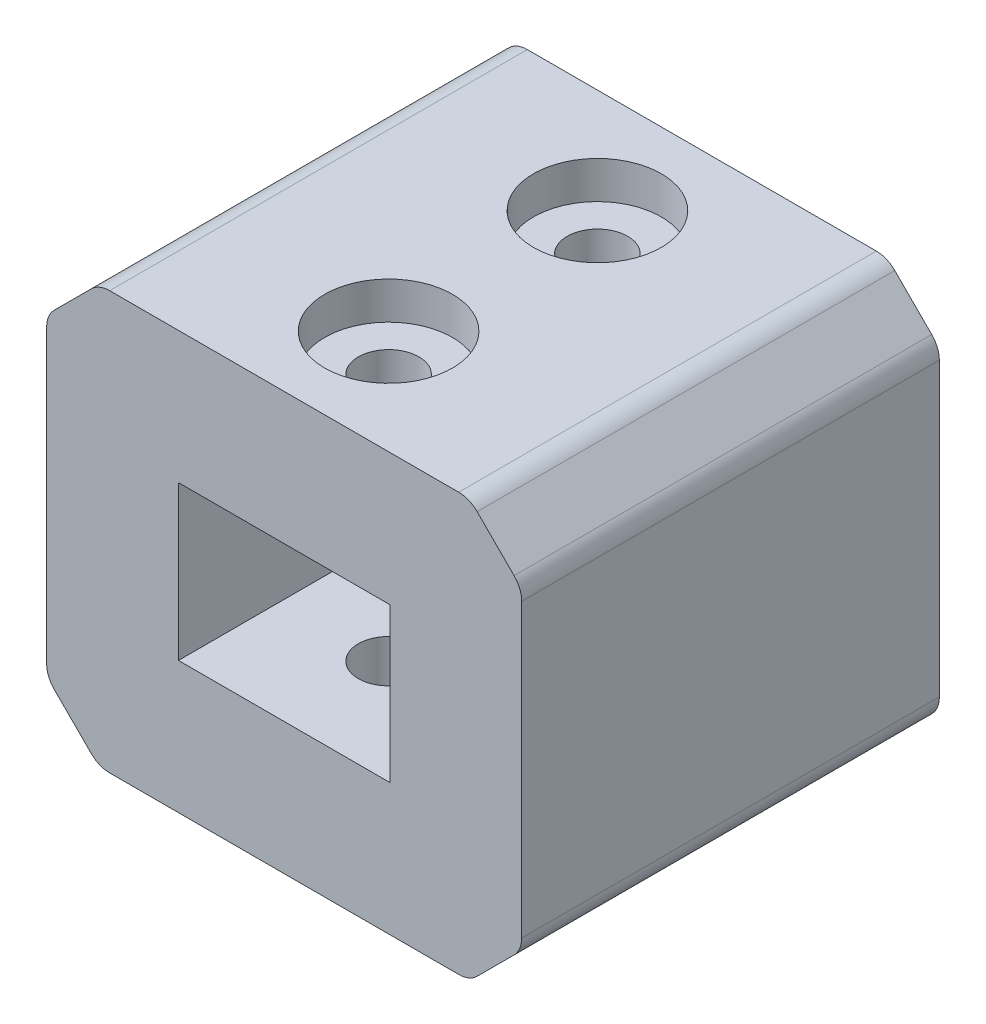
ISO-10303-21;
HEADER;
FILE_DESCRIPTION(('STEP AP214'),'2;1');
FILE_NAME('part.step','',(''),(''),'','','');
FILE_SCHEMA(('AUTOMOTIVE_DESIGN { 1 0 10303 214 1 1 1 1 }'));
ENDSEC;
DATA;
#1=APPLICATION_CONTEXT('core data for automotive mechanical design processes');
#2=APPLICATION_PROTOCOL_DEFINITION('international standard','automotive_design',2000,#1);
#3=PRODUCT_CONTEXT('',#1,'mechanical');
#4=PRODUCT('Part','Part','',(#3));
#5=PRODUCT_RELATED_PRODUCT_CATEGORY('part','',(#4));
#6=PRODUCT_DEFINITION_FORMATION('','',#4);
#7=PRODUCT_DEFINITION_CONTEXT('part definition',#1,'design');
#8=PRODUCT_DEFINITION('design','',#6,#7);
#9=PRODUCT_DEFINITION_SHAPE('','',#8);
#10=(LENGTH_UNIT() NAMED_UNIT(*) SI_UNIT(.MILLI.,.METRE.));
#11=(NAMED_UNIT(*) PLANE_ANGLE_UNIT() SI_UNIT($,.RADIAN.));
#12=(NAMED_UNIT(*) SI_UNIT($,.STERADIAN.) SOLID_ANGLE_UNIT());
#13=UNCERTAINTY_MEASURE_WITH_UNIT(LENGTH_MEASURE(1.E-05),#10,'distance_accuracy_value','');
#14=(GEOMETRIC_REPRESENTATION_CONTEXT(3) GLOBAL_UNCERTAINTY_ASSIGNED_CONTEXT((#13)) GLOBAL_UNIT_ASSIGNED_CONTEXT((#10,
#11,#12)) REPRESENTATION_CONTEXT('',''));
#15=CARTESIAN_POINT('',(0.,0.,0.));
#16=DIRECTION('',(0.,0.,1.));
#17=DIRECTION('',(1.,0.,0.));
#18=AXIS2_PLACEMENT_3D('',#15,#16,#17);
#19=CARTESIAN_POINT('',(-22.75,20.,40.));
#20=DIRECTION('',(0.,-1.,0.));
#21=DIRECTION('',(0.,0.,-1.));
#22=AXIS2_PLACEMENT_3D('',#19,#20,#21);
#23=PLANE('',#22);
#24=CARTESIAN_POINT('',(0.,20.,30.));
#25=DIRECTION('',(0.,1.,0.));
#26=DIRECTION('',(0.,0.,1.));
#27=AXIS2_PLACEMENT_3D('',#24,#25,#26);
#28=CIRCLE('',#27,6.12);
#29=CARTESIAN_POINT('',(0.,20.,36.12));
#30=VERTEX_POINT('',#29);
#31=EDGE_CURVE('E696',#30,#30,#28,.T.);
#32=ORIENTED_EDGE('',*,*,#31,.F.);
#33=EDGE_LOOP('',(#32));
#34=FACE_BOUND('',#33,.T.);
#35=DIRECTION('',(-1.,0.,0.));
#36=VECTOR('',#35,1.);
#37=CARTESIAN_POINT('',(-22.75,20.,40.));
#38=LINE('',#37,#36);
#39=CARTESIAN_POINT('',(16.7144660940673,20.,40.));
#40=VERTEX_POINT('',#39);
#41=CARTESIAN_POINT('',(-16.7144660940673,20.,40.));
#42=VERTEX_POINT('',#41);
#43=EDGE_CURVE('E247',#40,#42,#38,.T.);
#44=ORIENTED_EDGE('',*,*,#43,.F.);
#45=DIRECTION('',(0.,0.,1.));
#46=VECTOR('',#45,1.);
#47=CARTESIAN_POINT('',(16.7144660940673,20.,0.));
#48=LINE('',#47,#46);
#49=CARTESIAN_POINT('',(16.7144660940673,20.,0.));
#50=VERTEX_POINT('',#49);
#51=EDGE_CURVE('E308',#40,#50,#48,.F.);
#52=ORIENTED_EDGE('',*,*,#51,.T.);
#53=DIRECTION('',(-1.,0.,0.));
#54=VECTOR('',#53,1.);
#55=CARTESIAN_POINT('',(-22.75,20.,0.));
#56=LINE('',#55,#54);
#57=CARTESIAN_POINT('',(-16.7144660940673,20.,0.));
#58=VERTEX_POINT('',#57);
#59=EDGE_CURVE('E263',#50,#58,#56,.T.);
#60=ORIENTED_EDGE('',*,*,#59,.T.);
#61=DIRECTION('',(0.,0.,-1.));
#62=VECTOR('',#61,1.);
#63=CARTESIAN_POINT('',(-16.7144660940673,20.,40.));
#64=LINE('',#63,#62);
#65=EDGE_CURVE('E304',#58,#42,#64,.F.);
#66=ORIENTED_EDGE('',*,*,#65,.T.);
#67=EDGE_LOOP('',(#44,#52,#60,#66));
#68=FACE_BOUND('',#67,.T.);
#69=CARTESIAN_POINT('',(0.,20.,10.));
#70=DIRECTION('',(0.,1.,0.));
#71=DIRECTION('',(0.,0.,1.));
#72=AXIS2_PLACEMENT_3D('',#69,#70,#71);
#73=CIRCLE('',#72,6.12);
#74=CARTESIAN_POINT('',(0.,20.,16.12));
#75=VERTEX_POINT('',#74);
#76=EDGE_CURVE('E674',#75,#75,#73,.T.);
#77=ORIENTED_EDGE('',*,*,#76,.F.);
#78=EDGE_LOOP('',(#77));
#79=FACE_BOUND('',#78,.T.);
#80=ADVANCED_FACE('F47',(#34,#68,#79),#23,.F.);
#81=CARTESIAN_POINT('',(0.,0.,40.));
#82=DIRECTION('',(0.,0.,1.));
#83=DIRECTION('',(1.,0.,0.));
#84=AXIS2_PLACEMENT_3D('',#81,#82,#83);
#85=PLANE('',#84);
#86=DIRECTION('',(0.707106781186546,-0.707106781186549,0.));
#87=VECTOR('',#86,1.);
#88=CARTESIAN_POINT('',(18.875,18.875,40.));
#89=LINE('',#88,#87);
#90=CARTESIAN_POINT('',(22.0177669529664,15.7322330470336,40.));
#91=VERTEX_POINT('',#90);
#92=CARTESIAN_POINT('',(18.4822330470336,19.2677669529664,40.));
#93=VERTEX_POINT('',#92);
#94=EDGE_CURVE('E300',#91,#93,#89,.F.);
#95=ORIENTED_EDGE('',*,*,#94,.T.);
#96=CARTESIAN_POINT('',(16.7144660940673,17.5,40.));
#97=DIRECTION('',(0.,0.,1.));
#98=DIRECTION('',(1.,0.,0.));
#99=AXIS2_PLACEMENT_3D('',#96,#97,#98);
#100=CIRCLE('',#99,2.5);
#101=EDGE_CURVE('E362',#93,#40,#100,.T.);
#102=ORIENTED_EDGE('',*,*,#101,.T.);
#103=ORIENTED_EDGE('',*,*,#43,.T.);
#104=CARTESIAN_POINT('',(-16.7144660940673,17.5,40.));
#105=DIRECTION('',(0.,0.,1.));
#106=DIRECTION('',(1.,0.,0.));
#107=AXIS2_PLACEMENT_3D('',#104,#105,#106);
#108=CIRCLE('',#107,2.5);
#109=CARTESIAN_POINT('',(-18.4822330470336,19.2677669529664,40.));
#110=VERTEX_POINT('',#109);
#111=EDGE_CURVE('E342',#42,#110,#108,.T.);
#112=ORIENTED_EDGE('',*,*,#111,.T.);
#113=DIRECTION('',(0.707106781186549,0.707106781186547,0.));
#114=VECTOR('',#113,1.);
#115=CARTESIAN_POINT('',(-18.875,18.875,40.));
#116=LINE('',#115,#114);
#117=CARTESIAN_POINT('',(-22.0177669529664,15.7322330470336,40.));
#118=VERTEX_POINT('',#117);
#119=EDGE_CURVE('E289',#110,#118,#116,.F.);
#120=ORIENTED_EDGE('',*,*,#119,.T.);
#121=CARTESIAN_POINT('',(-20.25,13.9644660940673,40.));
#122=DIRECTION('',(0.,0.,1.));
#123=DIRECTION('',(1.,0.,0.));
#124=AXIS2_PLACEMENT_3D('',#121,#122,#123);
#125=CIRCLE('',#124,2.5);
#126=CARTESIAN_POINT('',(-22.75,13.9644660940673,40.));
#127=VERTEX_POINT('',#126);
#128=EDGE_CURVE('E345',#118,#127,#125,.T.);
#129=ORIENTED_EDGE('',*,*,#128,.T.);
#130=DIRECTION('',(0.,-1.,0.));
#131=VECTOR('',#130,1.);
#132=CARTESIAN_POINT('',(-22.75,20.,40.));
#133=LINE('',#132,#131);
#134=CARTESIAN_POINT('',(-22.75,-13.9644660940673,40.));
#135=VERTEX_POINT('',#134);
#136=EDGE_CURVE('E252',#127,#135,#133,.T.);
#137=ORIENTED_EDGE('',*,*,#136,.T.);
#138=CARTESIAN_POINT('',(-20.25,-13.9644660940673,40.));
#139=DIRECTION('',(0.,0.,1.));
#140=DIRECTION('',(1.,0.,0.));
#141=AXIS2_PLACEMENT_3D('',#138,#139,#140);
#142=CIRCLE('',#141,2.5);
#143=CARTESIAN_POINT('',(-22.0177669529664,-15.7322330470336,40.));
#144=VERTEX_POINT('',#143);
#145=EDGE_CURVE('E348',#135,#144,#142,.T.);
#146=ORIENTED_EDGE('',*,*,#145,.T.);
#147=DIRECTION('',(-0.707106781186546,0.707106781186549,0.));
#148=VECTOR('',#147,1.);
#149=CARTESIAN_POINT('',(-18.875,-18.875,40.));
#150=LINE('',#149,#148);
#151=CARTESIAN_POINT('',(-18.4822330470336,-19.2677669529664,40.));
#152=VERTEX_POINT('',#151);
#153=EDGE_CURVE('E293',#144,#152,#150,.F.);
#154=ORIENTED_EDGE('',*,*,#153,.T.);
#155=CARTESIAN_POINT('',(-16.7144660940673,-17.5,40.));
#156=DIRECTION('',(0.,0.,1.));
#157=DIRECTION('',(1.,0.,0.));
#158=AXIS2_PLACEMENT_3D('',#155,#156,#157);
#159=CIRCLE('',#158,2.5);
#160=CARTESIAN_POINT('',(-16.7144660940673,-20.,40.));
#161=VERTEX_POINT('',#160);
#162=EDGE_CURVE('E351',#152,#161,#159,.T.);
#163=ORIENTED_EDGE('',*,*,#162,.T.);
#164=DIRECTION('',(1.,0.,0.));
#165=VECTOR('',#164,1.);
#166=CARTESIAN_POINT('',(-22.75,-20.,40.));
#167=LINE('',#166,#165);
#168=CARTESIAN_POINT('',(16.7144660940673,-20.,40.));
#169=VERTEX_POINT('',#168);
#170=EDGE_CURVE('E256',#161,#169,#167,.T.);
#171=ORIENTED_EDGE('',*,*,#170,.T.);
#172=CARTESIAN_POINT('',(16.7144660940673,-17.5,40.));
#173=DIRECTION('',(0.,0.,1.));
#174=DIRECTION('',(1.,0.,0.));
#175=AXIS2_PLACEMENT_3D('',#172,#173,#174);
#176=CIRCLE('',#175,2.5);
#177=CARTESIAN_POINT('',(18.4822330470336,-19.2677669529664,40.));
#178=VERTEX_POINT('',#177);
#179=EDGE_CURVE('E71',#169,#178,#176,.T.);
#180=ORIENTED_EDGE('',*,*,#179,.T.);
#181=DIRECTION('',(-0.707106781186549,-0.707106781186547,0.));
#182=VECTOR('',#181,1.);
#183=CARTESIAN_POINT('',(18.875,-18.875,40.));
#184=LINE('',#183,#182);
#185=CARTESIAN_POINT('',(22.0177669529664,-15.7322330470336,40.));
#186=VERTEX_POINT('',#185);
#187=EDGE_CURVE('E297',#178,#186,#184,.F.);
#188=ORIENTED_EDGE('',*,*,#187,.T.);
#189=CARTESIAN_POINT('',(20.25,-13.9644660940673,40.));
#190=DIRECTION('',(0.,0.,1.));
#191=DIRECTION('',(1.,0.,0.));
#192=AXIS2_PLACEMENT_3D('',#189,#190,#191);
#193=CIRCLE('',#192,2.5);
#194=CARTESIAN_POINT('',(22.75,-13.9644660940673,40.));
#195=VERTEX_POINT('',#194);
#196=EDGE_CURVE('E356',#186,#195,#193,.T.);
#197=ORIENTED_EDGE('',*,*,#196,.T.);
#198=DIRECTION('',(0.,1.,0.));
#199=VECTOR('',#198,1.);
#200=CARTESIAN_POINT('',(22.75,20.,40.));
#201=LINE('',#200,#199);
#202=CARTESIAN_POINT('',(22.75,13.9644660940672,40.));
#203=VERTEX_POINT('',#202);
#204=EDGE_CURVE('E243',#195,#203,#201,.T.);
#205=ORIENTED_EDGE('',*,*,#204,.T.);
#206=CARTESIAN_POINT('',(20.25,13.9644660940672,40.));
#207=DIRECTION('',(0.,0.,1.));
#208=DIRECTION('',(1.,0.,0.));
#209=AXIS2_PLACEMENT_3D('',#206,#207,#208);
#210=CIRCLE('',#209,2.5);
#211=EDGE_CURVE('E359',#203,#91,#210,.T.);
#212=ORIENTED_EDGE('',*,*,#211,.T.);
#213=EDGE_LOOP('',(#95,#102,#103,#112,#120,#129,#137,#146,#154,#163,#171,#180,#188,#197,#205,#212));
#214=FACE_BOUND('',#213,.T.);
#215=DIRECTION('',(-1.,0.,0.));
#216=VECTOR('',#215,1.);
#217=CARTESIAN_POINT('',(-10.125,7.37500000000001,40.));
#218=LINE('',#217,#216);
#219=CARTESIAN_POINT('',(10.125,7.37500000000001,40.));
#220=VERTEX_POINT('',#219);
#221=CARTESIAN_POINT('',(-10.125,7.37500000000001,40.));
#222=VERTEX_POINT('',#221);
#223=EDGE_CURVE('E198',#220,#222,#218,.T.);
#224=ORIENTED_EDGE('',*,*,#223,.F.);
#225=DIRECTION('',(0.,1.,0.));
#226=VECTOR('',#225,1.);
#227=CARTESIAN_POINT('',(10.125,7.37500000000001,40.));
#228=LINE('',#227,#226);
#229=CARTESIAN_POINT('',(10.125,-7.37499999999999,40.));
#230=VERTEX_POINT('',#229);
#231=EDGE_CURVE('E187',#230,#220,#228,.T.);
#232=ORIENTED_EDGE('',*,*,#231,.F.);
#233=DIRECTION('',(1.,0.,0.));
#234=VECTOR('',#233,1.);
#235=CARTESIAN_POINT('',(-10.125,-7.37499999999999,40.));
#236=LINE('',#235,#234);
#237=CARTESIAN_POINT('',(-10.125,-7.37499999999999,40.));
#238=VERTEX_POINT('',#237);
#239=EDGE_CURVE('E217',#238,#230,#236,.T.);
#240=ORIENTED_EDGE('',*,*,#239,.F.);
#241=DIRECTION('',(0.,-1.,0.));
#242=VECTOR('',#241,1.);
#243=CARTESIAN_POINT('',(-10.125,7.37500000000001,40.));
#244=LINE('',#243,#242);
#245=EDGE_CURVE('E213',#222,#238,#244,.T.);
#246=ORIENTED_EDGE('',*,*,#245,.F.);
#247=EDGE_LOOP('',(#224,#232,#240,#246));
#248=FACE_BOUND('',#247,.T.);
#249=ADVANCED_FACE('F211',(#214,#248),#85,.T.);
#250=CARTESIAN_POINT('',(0.,0.,0.));
#251=DIRECTION('',(0.,0.,1.));
#252=DIRECTION('',(1.,0.,0.));
#253=AXIS2_PLACEMENT_3D('',#250,#251,#252);
#254=PLANE('',#253);
#255=ORIENTED_EDGE('',*,*,#59,.F.);
#256=CARTESIAN_POINT('',(16.7144660940673,17.5,0.));
#257=DIRECTION('',(0.,0.,1.));
#258=DIRECTION('',(1.,0.,0.));
#259=AXIS2_PLACEMENT_3D('',#256,#257,#258);
#260=CIRCLE('',#259,2.5);
#261=CARTESIAN_POINT('',(18.4822330470336,19.2677669529664,0.));
#262=VERTEX_POINT('',#261);
#263=EDGE_CURVE('E333',#50,#262,#260,.F.);
#264=ORIENTED_EDGE('',*,*,#263,.T.);
#265=DIRECTION('',(-0.707106781186546,0.707106781186549,0.));
#266=VECTOR('',#265,1.);
#267=CARTESIAN_POINT('',(17.75,20.,0.));
#268=LINE('',#267,#266);
#269=CARTESIAN_POINT('',(22.0177669529664,15.7322330470336,0.));
#270=VERTEX_POINT('',#269);
#271=EDGE_CURVE('E285',#262,#270,#268,.F.);
#272=ORIENTED_EDGE('',*,*,#271,.T.);
#273=CARTESIAN_POINT('',(20.25,13.9644660940672,0.));
#274=DIRECTION('',(0.,0.,1.));
#275=DIRECTION('',(1.,0.,0.));
#276=AXIS2_PLACEMENT_3D('',#273,#274,#275);
#277=CIRCLE('',#276,2.5);
#278=CARTESIAN_POINT('',(22.75,13.9644660940672,0.));
#279=VERTEX_POINT('',#278);
#280=EDGE_CURVE('E330',#270,#279,#277,.F.);
#281=ORIENTED_EDGE('',*,*,#280,.T.);
#282=DIRECTION('',(0.,1.,0.));
#283=VECTOR('',#282,1.);
#284=CARTESIAN_POINT('',(22.75,20.,0.));
#285=LINE('',#284,#283);
#286=CARTESIAN_POINT('',(22.75,-13.9644660940673,0.));
#287=VERTEX_POINT('',#286);
#288=EDGE_CURVE('E207',#287,#279,#285,.T.);
#289=ORIENTED_EDGE('',*,*,#288,.F.);
#290=CARTESIAN_POINT('',(20.25,-13.9644660940673,0.));
#291=DIRECTION('',(0.,0.,1.));
#292=DIRECTION('',(1.,0.,0.));
#293=AXIS2_PLACEMENT_3D('',#290,#291,#292);
#294=CIRCLE('',#293,2.5);
#295=CARTESIAN_POINT('',(22.0177669529664,-15.7322330470336,0.));
#296=VERTEX_POINT('',#295);
#297=EDGE_CURVE('E327',#287,#296,#294,.F.);
#298=ORIENTED_EDGE('',*,*,#297,.T.);
#299=DIRECTION('',(0.707106781186549,0.707106781186547,0.));
#300=VECTOR('',#299,1.);
#301=CARTESIAN_POINT('',(22.75,-15.,0.));
#302=LINE('',#301,#300);
#303=CARTESIAN_POINT('',(18.4822330470336,-19.2677669529664,0.));
#304=VERTEX_POINT('',#303);
#305=EDGE_CURVE('E281',#296,#304,#302,.F.);
#306=ORIENTED_EDGE('',*,*,#305,.T.);
#307=CARTESIAN_POINT('',(16.7144660940673,-17.5,0.));
#308=DIRECTION('',(0.,0.,1.));
#309=DIRECTION('',(1.,0.,0.));
#310=AXIS2_PLACEMENT_3D('',#307,#308,#309);
#311=CIRCLE('',#310,2.5);
#312=CARTESIAN_POINT('',(16.7144660940673,-20.,0.));
#313=VERTEX_POINT('',#312);
#314=EDGE_CURVE('E324',#304,#313,#311,.F.);
#315=ORIENTED_EDGE('',*,*,#314,.T.);
#316=DIRECTION('',(1.,0.,0.));
#317=VECTOR('',#316,1.);
#318=CARTESIAN_POINT('',(-22.75,-20.,0.));
#319=LINE('',#318,#317);
#320=CARTESIAN_POINT('',(-16.7144660940673,-20.,0.));
#321=VERTEX_POINT('',#320);
#322=EDGE_CURVE('E248',#321,#313,#319,.T.);
#323=ORIENTED_EDGE('',*,*,#322,.F.);
#324=CARTESIAN_POINT('',(-16.7144660940673,-17.5,0.));
#325=DIRECTION('',(0.,0.,1.));
#326=DIRECTION('',(1.,0.,0.));
#327=AXIS2_PLACEMENT_3D('',#324,#325,#326);
#328=CIRCLE('',#327,2.5);
#329=CARTESIAN_POINT('',(-18.4822330470336,-19.2677669529664,0.));
#330=VERTEX_POINT('',#329);
#331=EDGE_CURVE('E321',#321,#330,#328,.F.);
#332=ORIENTED_EDGE('',*,*,#331,.T.);
#333=DIRECTION('',(0.707106781186546,-0.707106781186549,0.));
#334=VECTOR('',#333,1.);
#335=CARTESIAN_POINT('',(-17.75,-20.,0.));
#336=LINE('',#335,#334);
#337=CARTESIAN_POINT('',(-22.0177669529664,-15.7322330470336,0.));
#338=VERTEX_POINT('',#337);
#339=EDGE_CURVE('E277',#330,#338,#336,.F.);
#340=ORIENTED_EDGE('',*,*,#339,.T.);
#341=CARTESIAN_POINT('',(-20.25,-13.9644660940673,0.));
#342=DIRECTION('',(0.,0.,1.));
#343=DIRECTION('',(1.,0.,0.));
#344=AXIS2_PLACEMENT_3D('',#341,#342,#343);
#345=CIRCLE('',#344,2.5);
#346=CARTESIAN_POINT('',(-22.75,-13.9644660940673,0.));
#347=VERTEX_POINT('',#346);
#348=EDGE_CURVE('E318',#338,#347,#345,.F.);
#349=ORIENTED_EDGE('',*,*,#348,.T.);
#350=DIRECTION('',(0.,-1.,0.));
#351=VECTOR('',#350,1.);
#352=CARTESIAN_POINT('',(-22.75,20.,0.));
#353=LINE('',#352,#351);
#354=CARTESIAN_POINT('',(-22.75,13.9644660940673,0.));
#355=VERTEX_POINT('',#354);
#356=EDGE_CURVE('E267',#355,#347,#353,.T.);
#357=ORIENTED_EDGE('',*,*,#356,.F.);
#358=CARTESIAN_POINT('',(-20.25,13.9644660940673,0.));
#359=DIRECTION('',(0.,0.,1.));
#360=DIRECTION('',(1.,0.,0.));
#361=AXIS2_PLACEMENT_3D('',#358,#359,#360);
#362=CIRCLE('',#361,2.5);
#363=CARTESIAN_POINT('',(-22.0177669529664,15.7322330470336,0.));
#364=VERTEX_POINT('',#363);
#365=EDGE_CURVE('E315',#355,#364,#362,.F.);
#366=ORIENTED_EDGE('',*,*,#365,.T.);
#367=DIRECTION('',(-0.707106781186549,-0.707106781186547,0.));
#368=VECTOR('',#367,1.);
#369=CARTESIAN_POINT('',(-22.75,15.,0.));
#370=LINE('',#369,#368);
#371=CARTESIAN_POINT('',(-18.4822330470336,19.2677669529664,0.));
#372=VERTEX_POINT('',#371);
#373=EDGE_CURVE('E259',#364,#372,#370,.F.);
#374=ORIENTED_EDGE('',*,*,#373,.T.);
#375=CARTESIAN_POINT('',(-16.7144660940673,17.5,0.));
#376=DIRECTION('',(0.,0.,1.));
#377=DIRECTION('',(1.,0.,0.));
#378=AXIS2_PLACEMENT_3D('',#375,#376,#377);
#379=CIRCLE('',#378,2.5);
#380=EDGE_CURVE('E312',#372,#58,#379,.F.);
#381=ORIENTED_EDGE('',*,*,#380,.T.);
#382=EDGE_LOOP('',(#255,#264,#272,#281,#289,#298,#306,#315,#323,#332,#340,#349,#357,#366,#374,#381));
#383=FACE_BOUND('',#382,.T.);
#384=DIRECTION('',(0.,1.,0.));
#385=VECTOR('',#384,1.);
#386=CARTESIAN_POINT('',(10.125,7.37500000000001,0.));
#387=LINE('',#386,#385);
#388=CARTESIAN_POINT('',(10.125,-7.37499999999999,0.));
#389=VERTEX_POINT('',#388);
#390=CARTESIAN_POINT('',(10.125,7.37500000000001,0.));
#391=VERTEX_POINT('',#390);
#392=EDGE_CURVE('E223',#389,#391,#387,.T.);
#393=ORIENTED_EDGE('',*,*,#392,.T.);
#394=DIRECTION('',(-1.,0.,0.));
#395=VECTOR('',#394,1.);
#396=CARTESIAN_POINT('',(-10.125,7.37500000000001,0.));
#397=LINE('',#396,#395);
#398=CARTESIAN_POINT('',(-10.125,7.37500000000001,0.));
#399=VERTEX_POINT('',#398);
#400=EDGE_CURVE('E205',#391,#399,#397,.T.);
#401=ORIENTED_EDGE('',*,*,#400,.T.);
#402=DIRECTION('',(0.,-1.,0.));
#403=VECTOR('',#402,1.);
#404=CARTESIAN_POINT('',(-10.125,7.37500000000001,0.));
#405=LINE('',#404,#403);
#406=CARTESIAN_POINT('',(-10.125,-7.37499999999999,0.));
#407=VERTEX_POINT('',#406);
#408=EDGE_CURVE('E229',#399,#407,#405,.T.);
#409=ORIENTED_EDGE('',*,*,#408,.T.);
#410=DIRECTION('',(1.,0.,0.));
#411=VECTOR('',#410,1.);
#412=CARTESIAN_POINT('',(-10.125,-7.37499999999999,0.));
#413=LINE('',#412,#411);
#414=EDGE_CURVE('E199',#407,#389,#413,.T.);
#415=ORIENTED_EDGE('',*,*,#414,.T.);
#416=EDGE_LOOP('',(#393,#401,#409,#415));
#417=FACE_BOUND('',#416,.T.);
#418=ADVANCED_FACE('F411',(#383,#417),#254,.F.);
#419=CARTESIAN_POINT('',(22.75,20.,40.));
#420=DIRECTION('',(-1.,0.,0.));
#421=DIRECTION('',(0.,-1.,0.));
#422=AXIS2_PLACEMENT_3D('',#419,#420,#421);
#423=PLANE('',#422);
#424=ORIENTED_EDGE('',*,*,#288,.T.);
#425=DIRECTION('',(0.,0.,-1.));
#426=VECTOR('',#425,1.);
#427=CARTESIAN_POINT('',(22.75,13.9644660940672,40.));
#428=LINE('',#427,#426);
#429=EDGE_CURVE('E369',#279,#203,#428,.F.);
#430=ORIENTED_EDGE('',*,*,#429,.T.);
#431=ORIENTED_EDGE('',*,*,#204,.F.);
#432=DIRECTION('',(0.,0.,1.));
#433=VECTOR('',#432,1.);
#434=CARTESIAN_POINT('',(22.75,-13.9644660940673,0.));
#435=LINE('',#434,#433);
#436=EDGE_CURVE('E365',#195,#287,#435,.F.);
#437=ORIENTED_EDGE('',*,*,#436,.T.);
#438=EDGE_LOOP('',(#424,#430,#431,#437));
#439=FACE_BOUND('',#438,.T.);
#440=ADVANCED_FACE('F434',(#439),#423,.F.);
#441=CARTESIAN_POINT('',(-22.75,20.,40.));
#442=DIRECTION('',(1.,0.,0.));
#443=DIRECTION('',(0.,1.,0.));
#444=AXIS2_PLACEMENT_3D('',#441,#442,#443);
#445=PLANE('',#444);
#446=ORIENTED_EDGE('',*,*,#356,.T.);
#447=DIRECTION('',(0.,0.,-1.));
#448=VECTOR('',#447,1.);
#449=CARTESIAN_POINT('',(-22.75,-13.9644660940673,40.));
#450=LINE('',#449,#448);
#451=EDGE_CURVE('E396',#347,#135,#450,.F.);
#452=ORIENTED_EDGE('',*,*,#451,.T.);
#453=ORIENTED_EDGE('',*,*,#136,.F.);
#454=DIRECTION('',(0.,0.,1.));
#455=VECTOR('',#454,1.);
#456=CARTESIAN_POINT('',(-22.75,13.9644660940673,0.));
#457=LINE('',#456,#455);
#458=EDGE_CURVE('E392',#127,#355,#457,.F.);
#459=ORIENTED_EDGE('',*,*,#458,.T.);
#460=EDGE_LOOP('',(#446,#452,#453,#459));
#461=FACE_BOUND('',#460,.T.);
#462=ADVANCED_FACE('F465',(#461),#445,.F.);
#463=CARTESIAN_POINT('',(-22.75,-20.,40.));
#464=DIRECTION('',(0.,1.,0.));
#465=DIRECTION('',(0.,0.,1.));
#466=AXIS2_PLACEMENT_3D('',#463,#464,#465);
#467=PLANE('',#466);
#468=CARTESIAN_POINT('',(0.,-20.,30.));
#469=DIRECTION('',(0.,1.,0.));
#470=DIRECTION('',(0.,0.,1.));
#471=AXIS2_PLACEMENT_3D('',#468,#469,#470);
#472=CIRCLE('',#471,2.89999999999999);
#473=CARTESIAN_POINT('',(0.,-20.,32.9));
#474=VERTEX_POINT('',#473);
#475=EDGE_CURVE('E649',#474,#474,#472,.T.);
#476=ORIENTED_EDGE('',*,*,#475,.T.);
#477=EDGE_LOOP('',(#476));
#478=FACE_BOUND('',#477,.T.);
#479=CARTESIAN_POINT('',(0.,-20.,10.));
#480=DIRECTION('',(0.,1.,0.));
#481=DIRECTION('',(0.,0.,1.));
#482=AXIS2_PLACEMENT_3D('',#479,#480,#481);
#483=CIRCLE('',#482,2.89999999999999);
#484=CARTESIAN_POINT('',(0.,-20.,12.9));
#485=VERTEX_POINT('',#484);
#486=EDGE_CURVE('E652',#485,#485,#483,.T.);
#487=ORIENTED_EDGE('',*,*,#486,.T.);
#488=EDGE_LOOP('',(#487));
#489=FACE_BOUND('',#488,.T.);
#490=ORIENTED_EDGE('',*,*,#322,.T.);
#491=DIRECTION('',(0.,0.,-1.));
#492=VECTOR('',#491,1.);
#493=CARTESIAN_POINT('',(16.7144660940673,-20.,40.));
#494=LINE('',#493,#492);
#495=EDGE_CURVE('E382',#313,#169,#494,.F.);
#496=ORIENTED_EDGE('',*,*,#495,.T.);
#497=ORIENTED_EDGE('',*,*,#170,.F.);
#498=DIRECTION('',(0.,0.,1.));
#499=VECTOR('',#498,1.);
#500=CARTESIAN_POINT('',(-16.7144660940673,-20.,0.));
#501=LINE('',#500,#499);
#502=EDGE_CURVE('E378',#161,#321,#501,.F.);
#503=ORIENTED_EDGE('',*,*,#502,.T.);
#504=EDGE_LOOP('',(#490,#496,#497,#503));
#505=FACE_BOUND('',#504,.T.);
#506=ADVANCED_FACE('F448',(#478,#489,#505),#467,.F.);
#507=CARTESIAN_POINT('',(10.125,7.37500000000001,40.));
#508=DIRECTION('',(-1.,0.,0.));
#509=DIRECTION('',(0.,-1.,0.));
#510=AXIS2_PLACEMENT_3D('',#507,#508,#509);
#511=PLANE('',#510);
#512=ORIENTED_EDGE('',*,*,#392,.F.);
#513=DIRECTION('',(0.,0.,-1.));
#514=VECTOR('',#513,1.);
#515=CARTESIAN_POINT('',(10.125,-7.37499999999999,40.));
#516=LINE('',#515,#514);
#517=EDGE_CURVE('E193',#230,#389,#516,.T.);
#518=ORIENTED_EDGE('',*,*,#517,.F.);
#519=ORIENTED_EDGE('',*,*,#231,.T.);
#520=DIRECTION('',(0.,0.,-1.));
#521=VECTOR('',#520,1.);
#522=CARTESIAN_POINT('',(10.125,7.37500000000001,40.));
#523=LINE('',#522,#521);
#524=EDGE_CURVE('E190',#220,#391,#523,.T.);
#525=ORIENTED_EDGE('',*,*,#524,.T.);
#526=EDGE_LOOP('',(#512,#518,#519,#525));
#527=FACE_BOUND('',#526,.T.);
#528=ADVANCED_FACE('F189',(#527),#511,.T.);
#529=CARTESIAN_POINT('',(-10.125,7.37500000000001,40.));
#530=DIRECTION('',(0.,-1.,0.));
#531=DIRECTION('',(0.,0.,-1.));
#532=AXIS2_PLACEMENT_3D('',#529,#530,#531);
#533=PLANE('',#532);
#534=CARTESIAN_POINT('',(0.,7.37500000000001,30.));
#535=DIRECTION('',(0.,-1.,0.));
#536=DIRECTION('',(0.,0.,-1.));
#537=AXIS2_PLACEMENT_3D('',#534,#535,#536);
#538=CIRCLE('',#537,2.89999999999999);
#539=CARTESIAN_POINT('',(0.,7.37500000000001,27.1));
#540=VERTEX_POINT('',#539);
#541=EDGE_CURVE('E678',#540,#540,#538,.T.);
#542=ORIENTED_EDGE('',*,*,#541,.F.);
#543=EDGE_LOOP('',(#542));
#544=FACE_BOUND('',#543,.T.);
#545=CARTESIAN_POINT('',(0.,7.37500000000001,10.));
#546=DIRECTION('',(0.,-1.,0.));
#547=DIRECTION('',(0.,0.,-1.));
#548=AXIS2_PLACEMENT_3D('',#545,#546,#547);
#549=CIRCLE('',#548,2.89999999999999);
#550=CARTESIAN_POINT('',(0.,7.37500000000001,7.10000000000001));
#551=VERTEX_POINT('',#550);
#552=EDGE_CURVE('E51',#551,#551,#549,.T.);
#553=ORIENTED_EDGE('',*,*,#552,.F.);
#554=EDGE_LOOP('',(#553));
#555=FACE_BOUND('',#554,.T.);
#556=ORIENTED_EDGE('',*,*,#400,.F.);
#557=ORIENTED_EDGE('',*,*,#524,.F.);
#558=ORIENTED_EDGE('',*,*,#223,.T.);
#559=DIRECTION('',(0.,0.,-1.));
#560=VECTOR('',#559,1.);
#561=CARTESIAN_POINT('',(-10.125,7.37500000000001,40.));
#562=LINE('',#561,#560);
#563=EDGE_CURVE('E208',#222,#399,#562,.T.);
#564=ORIENTED_EDGE('',*,*,#563,.T.);
#565=EDGE_LOOP('',(#556,#557,#558,#564));
#566=FACE_BOUND('',#565,.T.);
#567=ADVANCED_FACE('F202',(#544,#555,#566),#533,.T.);
#568=CARTESIAN_POINT('',(-10.125,7.37500000000001,40.));
#569=DIRECTION('',(1.,0.,0.));
#570=DIRECTION('',(0.,1.,0.));
#571=AXIS2_PLACEMENT_3D('',#568,#569,#570);
#572=PLANE('',#571);
#573=ORIENTED_EDGE('',*,*,#408,.F.);
#574=ORIENTED_EDGE('',*,*,#563,.F.);
#575=ORIENTED_EDGE('',*,*,#245,.T.);
#576=DIRECTION('',(0.,0.,-1.));
#577=VECTOR('',#576,1.);
#578=CARTESIAN_POINT('',(-10.125,-7.37499999999999,40.));
#579=LINE('',#578,#577);
#580=EDGE_CURVE('E238',#238,#407,#579,.T.);
#581=ORIENTED_EDGE('',*,*,#580,.T.);
#582=EDGE_LOOP('',(#573,#574,#575,#581));
#583=FACE_BOUND('',#582,.T.);
#584=ADVANCED_FACE('F631',(#583),#572,.T.);
#585=CARTESIAN_POINT('',(-10.125,-7.37499999999999,40.));
#586=DIRECTION('',(0.,1.,0.));
#587=DIRECTION('',(0.,0.,1.));
#588=AXIS2_PLACEMENT_3D('',#585,#586,#587);
#589=PLANE('',#588);
#590=CARTESIAN_POINT('',(0.,-7.37499999999999,30.));
#591=DIRECTION('',(0.,1.,0.));
#592=DIRECTION('',(0.,0.,1.));
#593=AXIS2_PLACEMENT_3D('',#590,#591,#592);
#594=CIRCLE('',#593,2.89999999999999);
#595=CARTESIAN_POINT('',(0.,-7.37499999999999,32.9));
#596=VERTEX_POINT('',#595);
#597=EDGE_CURVE('E682',#596,#596,#594,.T.);
#598=ORIENTED_EDGE('',*,*,#597,.F.);
#599=EDGE_LOOP('',(#598));
#600=FACE_BOUND('',#599,.T.);
#601=CARTESIAN_POINT('',(0.,-7.37499999999999,10.));
#602=DIRECTION('',(0.,1.,0.));
#603=DIRECTION('',(0.,0.,1.));
#604=AXIS2_PLACEMENT_3D('',#601,#602,#603);
#605=CIRCLE('',#604,2.89999999999999);
#606=CARTESIAN_POINT('',(0.,-7.37499999999999,12.9));
#607=VERTEX_POINT('',#606);
#608=EDGE_CURVE('E226',#607,#607,#605,.T.);
#609=ORIENTED_EDGE('',*,*,#608,.F.);
#610=EDGE_LOOP('',(#609));
#611=FACE_BOUND('',#610,.T.);
#612=ORIENTED_EDGE('',*,*,#414,.F.);
#613=ORIENTED_EDGE('',*,*,#580,.F.);
#614=ORIENTED_EDGE('',*,*,#239,.T.);
#615=ORIENTED_EDGE('',*,*,#517,.T.);
#616=EDGE_LOOP('',(#612,#613,#614,#615));
#617=FACE_BOUND('',#616,.T.);
#618=ADVANCED_FACE('F499',(#600,#611,#617),#589,.T.);
#619=CARTESIAN_POINT('',(17.75,20.,40.));
#620=DIRECTION('',(-0.707106781186549,-0.707106781186546,0.));
#621=DIRECTION('',(0.,0.,-1.));
#622=AXIS2_PLACEMENT_3D('',#619,#620,#621);
#623=PLANE('',#622);
#624=ORIENTED_EDGE('',*,*,#271,.F.);
#625=DIRECTION('',(0.,0.,-1.));
#626=VECTOR('',#625,1.);
#627=CARTESIAN_POINT('',(18.4822330470336,19.2677669529664,40.));
#628=LINE('',#627,#626);
#629=EDGE_CURVE('E339',#262,#93,#628,.F.);
#630=ORIENTED_EDGE('',*,*,#629,.T.);
#631=ORIENTED_EDGE('',*,*,#94,.F.);
#632=DIRECTION('',(0.,0.,1.));
#633=VECTOR('',#632,1.);
#634=CARTESIAN_POINT('',(22.0177669529664,15.7322330470336,0.));
#635=LINE('',#634,#633);
#636=EDGE_CURVE('E336',#91,#270,#635,.F.);
#637=ORIENTED_EDGE('',*,*,#636,.T.);
#638=EDGE_LOOP('',(#624,#630,#631,#637));
#639=FACE_BOUND('',#638,.T.);
#640=ADVANCED_FACE('F427',(#639),#623,.F.);
#641=CARTESIAN_POINT('',(22.75,-15.,40.));
#642=DIRECTION('',(-0.707106781186547,0.707106781186549,0.));
#643=DIRECTION('',(0.,0.,-1.));
#644=AXIS2_PLACEMENT_3D('',#641,#642,#643);
#645=PLANE('',#644);
#646=ORIENTED_EDGE('',*,*,#305,.F.);
#647=DIRECTION('',(0.,0.,-1.));
#648=VECTOR('',#647,1.);
#649=CARTESIAN_POINT('',(22.0177669529664,-15.7322330470336,40.));
#650=LINE('',#649,#648);
#651=EDGE_CURVE('E64',#296,#186,#650,.F.);
#652=ORIENTED_EDGE('',*,*,#651,.T.);
#653=ORIENTED_EDGE('',*,*,#187,.F.);
#654=DIRECTION('',(0.,0.,1.));
#655=VECTOR('',#654,1.);
#656=CARTESIAN_POINT('',(18.4822330470336,-19.2677669529664,0.));
#657=LINE('',#656,#655);
#658=EDGE_CURVE('E373',#178,#304,#657,.F.);
#659=ORIENTED_EDGE('',*,*,#658,.T.);
#660=EDGE_LOOP('',(#646,#652,#653,#659));
#661=FACE_BOUND('',#660,.T.);
#662=ADVANCED_FACE('F441',(#661),#645,.F.);
#663=CARTESIAN_POINT('',(-17.75,-20.,40.));
#664=DIRECTION('',(0.707106781186549,0.707106781186546,0.));
#665=DIRECTION('',(0.,0.,-1.));
#666=AXIS2_PLACEMENT_3D('',#663,#664,#665);
#667=PLANE('',#666);
#668=ORIENTED_EDGE('',*,*,#339,.F.);
#669=DIRECTION('',(0.,0.,-1.));
#670=VECTOR('',#669,1.);
#671=CARTESIAN_POINT('',(-18.4822330470336,-19.2677669529664,40.));
#672=LINE('',#671,#670);
#673=EDGE_CURVE('E389',#330,#152,#672,.F.);
#674=ORIENTED_EDGE('',*,*,#673,.T.);
#675=ORIENTED_EDGE('',*,*,#153,.F.);
#676=DIRECTION('',(0.,0.,1.));
#677=VECTOR('',#676,1.);
#678=CARTESIAN_POINT('',(-22.0177669529664,-15.7322330470336,0.));
#679=LINE('',#678,#677);
#680=EDGE_CURVE('E386',#144,#338,#679,.F.);
#681=ORIENTED_EDGE('',*,*,#680,.T.);
#682=EDGE_LOOP('',(#668,#674,#675,#681));
#683=FACE_BOUND('',#682,.T.);
#684=ADVANCED_FACE('F458',(#683),#667,.F.);
#685=CARTESIAN_POINT('',(-22.75,15.,40.));
#686=DIRECTION('',(0.707106781186547,-0.707106781186549,0.));
#687=DIRECTION('',(0.,0.,-1.));
#688=AXIS2_PLACEMENT_3D('',#685,#686,#687);
#689=PLANE('',#688);
#690=ORIENTED_EDGE('',*,*,#373,.F.);
#691=DIRECTION('',(0.,0.,-1.));
#692=VECTOR('',#691,1.);
#693=CARTESIAN_POINT('',(-22.0177669529664,15.7322330470336,40.));
#694=LINE('',#693,#692);
#695=EDGE_CURVE('E11',#364,#118,#694,.F.);
#696=ORIENTED_EDGE('',*,*,#695,.T.);
#697=ORIENTED_EDGE('',*,*,#119,.F.);
#698=DIRECTION('',(0.,0.,1.));
#699=VECTOR('',#698,1.);
#700=CARTESIAN_POINT('',(-18.4822330470336,19.2677669529664,0.));
#701=LINE('',#700,#699);
#702=EDGE_CURVE('E57',#110,#372,#701,.F.);
#703=ORIENTED_EDGE('',*,*,#702,.T.);
#704=EDGE_LOOP('',(#690,#696,#697,#703));
#705=FACE_BOUND('',#704,.T.);
#706=ADVANCED_FACE('F405',(#705),#689,.F.);
#707=CARTESIAN_POINT('',(16.7144660940673,17.5,40.));
#708=DIRECTION('',(0.,0.,-1.));
#709=DIRECTION('',(-1.,0.,0.));
#710=AXIS2_PLACEMENT_3D('',#707,#708,#709);
#711=CYLINDRICAL_SURFACE('',#710,2.5);
#712=ORIENTED_EDGE('',*,*,#101,.F.);
#713=ORIENTED_EDGE('',*,*,#629,.F.);
#714=ORIENTED_EDGE('',*,*,#263,.F.);
#715=ORIENTED_EDGE('',*,*,#51,.F.);
#716=EDGE_LOOP('',(#712,#713,#714,#715));
#717=FACE_BOUND('',#716,.T.);
#718=ADVANCED_FACE('F423',(#717),#711,.T.);
#719=CARTESIAN_POINT('',(20.25,13.9644660940672,40.));
#720=DIRECTION('',(0.,0.,1.));
#721=DIRECTION('',(1.,0.,0.));
#722=AXIS2_PLACEMENT_3D('',#719,#720,#721);
#723=CYLINDRICAL_SURFACE('',#722,2.5);
#724=ORIENTED_EDGE('',*,*,#280,.F.);
#725=ORIENTED_EDGE('',*,*,#636,.F.);
#726=ORIENTED_EDGE('',*,*,#211,.F.);
#727=ORIENTED_EDGE('',*,*,#429,.F.);
#728=EDGE_LOOP('',(#724,#725,#726,#727));
#729=FACE_BOUND('',#728,.T.);
#730=ADVANCED_FACE('F430',(#729),#723,.T.);
#731=CARTESIAN_POINT('',(20.25,-13.9644660940673,40.));
#732=DIRECTION('',(0.,0.,-1.));
#733=DIRECTION('',(-1.,0.,0.));
#734=AXIS2_PLACEMENT_3D('',#731,#732,#733);
#735=CYLINDRICAL_SURFACE('',#734,2.5);
#736=ORIENTED_EDGE('',*,*,#196,.F.);
#737=ORIENTED_EDGE('',*,*,#651,.F.);
#738=ORIENTED_EDGE('',*,*,#297,.F.);
#739=ORIENTED_EDGE('',*,*,#436,.F.);
#740=EDGE_LOOP('',(#736,#737,#738,#739));
#741=FACE_BOUND('',#740,.T.);
#742=ADVANCED_FACE('F439',(#741),#735,.T.);
#743=CARTESIAN_POINT('',(16.7144660940673,-17.5,40.));
#744=DIRECTION('',(0.,0.,1.));
#745=DIRECTION('',(1.,0.,0.));
#746=AXIS2_PLACEMENT_3D('',#743,#744,#745);
#747=CYLINDRICAL_SURFACE('',#746,2.5);
#748=ORIENTED_EDGE('',*,*,#314,.F.);
#749=ORIENTED_EDGE('',*,*,#658,.F.);
#750=ORIENTED_EDGE('',*,*,#179,.F.);
#751=ORIENTED_EDGE('',*,*,#495,.F.);
#752=EDGE_LOOP('',(#748,#749,#750,#751));
#753=FACE_BOUND('',#752,.T.);
#754=ADVANCED_FACE('F444',(#753),#747,.T.);
#755=CARTESIAN_POINT('',(-16.7144660940673,-17.5,40.));
#756=DIRECTION('',(0.,0.,-1.));
#757=DIRECTION('',(-1.,0.,0.));
#758=AXIS2_PLACEMENT_3D('',#755,#756,#757);
#759=CYLINDRICAL_SURFACE('',#758,2.5);
#760=ORIENTED_EDGE('',*,*,#162,.F.);
#761=ORIENTED_EDGE('',*,*,#673,.F.);
#762=ORIENTED_EDGE('',*,*,#331,.F.);
#763=ORIENTED_EDGE('',*,*,#502,.F.);
#764=EDGE_LOOP('',(#760,#761,#762,#763));
#765=FACE_BOUND('',#764,.T.);
#766=ADVANCED_FACE('F453',(#765),#759,.T.);
#767=CARTESIAN_POINT('',(-20.25,-13.9644660940673,40.));
#768=DIRECTION('',(0.,0.,1.));
#769=DIRECTION('',(1.,0.,0.));
#770=AXIS2_PLACEMENT_3D('',#767,#768,#769);
#771=CYLINDRICAL_SURFACE('',#770,2.5);
#772=ORIENTED_EDGE('',*,*,#348,.F.);
#773=ORIENTED_EDGE('',*,*,#680,.F.);
#774=ORIENTED_EDGE('',*,*,#145,.F.);
#775=ORIENTED_EDGE('',*,*,#451,.F.);
#776=EDGE_LOOP('',(#772,#773,#774,#775));
#777=FACE_BOUND('',#776,.T.);
#778=ADVANCED_FACE('F462',(#777),#771,.T.);
#779=CARTESIAN_POINT('',(-20.25,13.9644660940673,40.));
#780=DIRECTION('',(0.,0.,-1.));
#781=DIRECTION('',(-1.,0.,0.));
#782=AXIS2_PLACEMENT_3D('',#779,#780,#781);
#783=CYLINDRICAL_SURFACE('',#782,2.5);
#784=ORIENTED_EDGE('',*,*,#128,.F.);
#785=ORIENTED_EDGE('',*,*,#695,.F.);
#786=ORIENTED_EDGE('',*,*,#365,.F.);
#787=ORIENTED_EDGE('',*,*,#458,.F.);
#788=EDGE_LOOP('',(#784,#785,#786,#787));
#789=FACE_BOUND('',#788,.T.);
#790=ADVANCED_FACE('F470',(#789),#783,.T.);
#791=CARTESIAN_POINT('',(-16.7144660940673,17.5,40.));
#792=DIRECTION('',(0.,0.,1.));
#793=DIRECTION('',(1.,0.,0.));
#794=AXIS2_PLACEMENT_3D('',#791,#792,#793);
#795=CYLINDRICAL_SURFACE('',#794,2.5);
#796=ORIENTED_EDGE('',*,*,#380,.F.);
#797=ORIENTED_EDGE('',*,*,#702,.F.);
#798=ORIENTED_EDGE('',*,*,#111,.F.);
#799=ORIENTED_EDGE('',*,*,#65,.F.);
#800=EDGE_LOOP('',(#796,#797,#798,#799));
#801=FACE_BOUND('',#800,.T.);
#802=ADVANCED_FACE('F49',(#801),#795,.T.);
#803=CARTESIAN_POINT('',(0.,20.,10.));
#804=DIRECTION('',(0.,1.,0.));
#805=DIRECTION('',(0.,0.,1.));
#806=AXIS2_PLACEMENT_3D('',#803,#804,#805);
#807=CYLINDRICAL_SURFACE('',#806,6.12);
#808=CARTESIAN_POINT('',(0.,16.42,10.));
#809=DIRECTION('',(0.,1.,0.));
#810=DIRECTION('',(0.,0.,1.));
#811=AXIS2_PLACEMENT_3D('',#808,#809,#810);
#812=CIRCLE('',#811,6.12);
#813=CARTESIAN_POINT('',(0.,16.42,16.12));
#814=VERTEX_POINT('',#813);
#815=EDGE_CURVE('E661',#814,#814,#812,.T.);
#816=ORIENTED_EDGE('',*,*,#815,.F.);
#817=EDGE_LOOP('',(#816));
#818=FACE_BOUND('',#817,.T.);
#819=ORIENTED_EDGE('',*,*,#76,.T.);
#820=EDGE_LOOP('',(#819));
#821=FACE_BOUND('',#820,.T.);
#822=ADVANCED_FACE('F476',(#818,#821),#807,.F.);
#823=CARTESIAN_POINT('',(2.9,16.42,10.));
#824=DIRECTION('',(0.,-1.,0.));
#825=DIRECTION('',(0.,0.,-1.));
#826=AXIS2_PLACEMENT_3D('',#823,#824,#825);
#827=PLANE('',#826);
#828=CARTESIAN_POINT('',(0.,16.42,10.));
#829=DIRECTION('',(0.,1.,0.));
#830=DIRECTION('',(0.,0.,1.));
#831=AXIS2_PLACEMENT_3D('',#828,#829,#830);
#832=CIRCLE('',#831,2.9);
#833=CARTESIAN_POINT('',(0.,16.42,12.9));
#834=VERTEX_POINT('',#833);
#835=EDGE_CURVE('E655',#834,#834,#832,.T.);
#836=ORIENTED_EDGE('',*,*,#835,.F.);
#837=EDGE_LOOP('',(#836));
#838=FACE_BOUND('',#837,.T.);
#839=ORIENTED_EDGE('',*,*,#815,.T.);
#840=EDGE_LOOP('',(#839));
#841=FACE_BOUND('',#840,.T.);
#842=ADVANCED_FACE('F556',(#838,#841),#827,.F.);
#843=CARTESIAN_POINT('',(0.,20.,10.));
#844=DIRECTION('',(0.,1.,0.));
#845=DIRECTION('',(0.,0.,1.));
#846=AXIS2_PLACEMENT_3D('',#843,#844,#845);
#847=CYLINDRICAL_SURFACE('',#846,2.89999999999999);
#848=ORIENTED_EDGE('',*,*,#552,.T.);
#849=EDGE_LOOP('',(#848));
#850=FACE_BOUND('',#849,.T.);
#851=ORIENTED_EDGE('',*,*,#835,.T.);
#852=EDGE_LOOP('',(#851));
#853=FACE_BOUND('',#852,.T.);
#854=ADVANCED_FACE('F566',(#850,#853),#847,.F.);
#855=ORIENTED_EDGE('',*,*,#608,.T.);
#856=EDGE_LOOP('',(#855));
#857=FACE_BOUND('',#856,.T.);
#858=ORIENTED_EDGE('',*,*,#486,.F.);
#859=EDGE_LOOP('',(#858));
#860=FACE_BOUND('',#859,.T.);
#861=ADVANCED_FACE('F576',(#857,#860),#847,.F.);
#862=CARTESIAN_POINT('',(0.,20.,30.));
#863=DIRECTION('',(0.,1.,0.));
#864=DIRECTION('',(0.,0.,1.));
#865=AXIS2_PLACEMENT_3D('',#862,#863,#864);
#866=CYLINDRICAL_SURFACE('',#865,2.89999999999999);
#867=ORIENTED_EDGE('',*,*,#597,.T.);
#868=EDGE_LOOP('',(#867));
#869=FACE_BOUND('',#868,.T.);
#870=ORIENTED_EDGE('',*,*,#475,.F.);
#871=EDGE_LOOP('',(#870));
#872=FACE_BOUND('',#871,.T.);
#873=ADVANCED_FACE('F585',(#869,#872),#866,.F.);
#874=ORIENTED_EDGE('',*,*,#541,.T.);
#875=EDGE_LOOP('',(#874));
#876=FACE_BOUND('',#875,.T.);
#877=CARTESIAN_POINT('',(0.,16.42,30.));
#878=DIRECTION('',(0.,1.,0.));
#879=DIRECTION('',(0.,0.,1.));
#880=AXIS2_PLACEMENT_3D('',#877,#878,#879);
#881=CIRCLE('',#880,2.9);
#882=CARTESIAN_POINT('',(0.,16.42,32.9));
#883=VERTEX_POINT('',#882);
#884=EDGE_CURVE('E688',#883,#883,#881,.T.);
#885=ORIENTED_EDGE('',*,*,#884,.T.);
#886=EDGE_LOOP('',(#885));
#887=FACE_BOUND('',#886,.T.);
#888=ADVANCED_FACE('F594',(#876,#887),#866,.F.);
#889=CARTESIAN_POINT('',(2.9,16.42,30.));
#890=DIRECTION('',(0.,-1.,0.));
#891=DIRECTION('',(0.,0.,-1.));
#892=AXIS2_PLACEMENT_3D('',#889,#890,#891);
#893=PLANE('',#892);
#894=ORIENTED_EDGE('',*,*,#884,.F.);
#895=EDGE_LOOP('',(#894));
#896=FACE_BOUND('',#895,.T.);
#897=CARTESIAN_POINT('',(0.,16.42,30.));
#898=DIRECTION('',(0.,1.,0.));
#899=DIRECTION('',(0.,0.,1.));
#900=AXIS2_PLACEMENT_3D('',#897,#898,#899);
#901=CIRCLE('',#900,6.12);
#902=CARTESIAN_POINT('',(0.,16.42,36.12));
#903=VERTEX_POINT('',#902);
#904=EDGE_CURVE('E692',#903,#903,#901,.T.);
#905=ORIENTED_EDGE('',*,*,#904,.T.);
#906=EDGE_LOOP('',(#905));
#907=FACE_BOUND('',#906,.T.);
#908=ADVANCED_FACE('F605',(#896,#907),#893,.F.);
#909=CARTESIAN_POINT('',(0.,20.,30.));
#910=DIRECTION('',(0.,1.,0.));
#911=DIRECTION('',(0.,0.,1.));
#912=AXIS2_PLACEMENT_3D('',#909,#910,#911);
#913=CYLINDRICAL_SURFACE('',#912,6.12);
#914=ORIENTED_EDGE('',*,*,#904,.F.);
#915=EDGE_LOOP('',(#914));
#916=FACE_BOUND('',#915,.T.);
#917=ORIENTED_EDGE('',*,*,#31,.T.);
#918=EDGE_LOOP('',(#917));
#919=FACE_BOUND('',#918,.T.);
#920=ADVANCED_FACE('F614',(#916,#919),#913,.F.);
#921=CLOSED_SHELL('',(#80,#249,#418,#440,#462,#506,#528,#567,#584,#618,#640,#662,#684,#706,#718,
#730,#742,#754,#766,#778,#790,#802,#822,#842,#854,#861,#873,#888,#908,#920));
#922=MANIFOLD_SOLID_BREP('B2',#921);
#923=ADVANCED_BREP_SHAPE_REPRESENTATION('',(#18,#922),#14);
#924=SHAPE_DEFINITION_REPRESENTATION(#9,#923);
ENDSEC;
END-ISO-10303-21;
